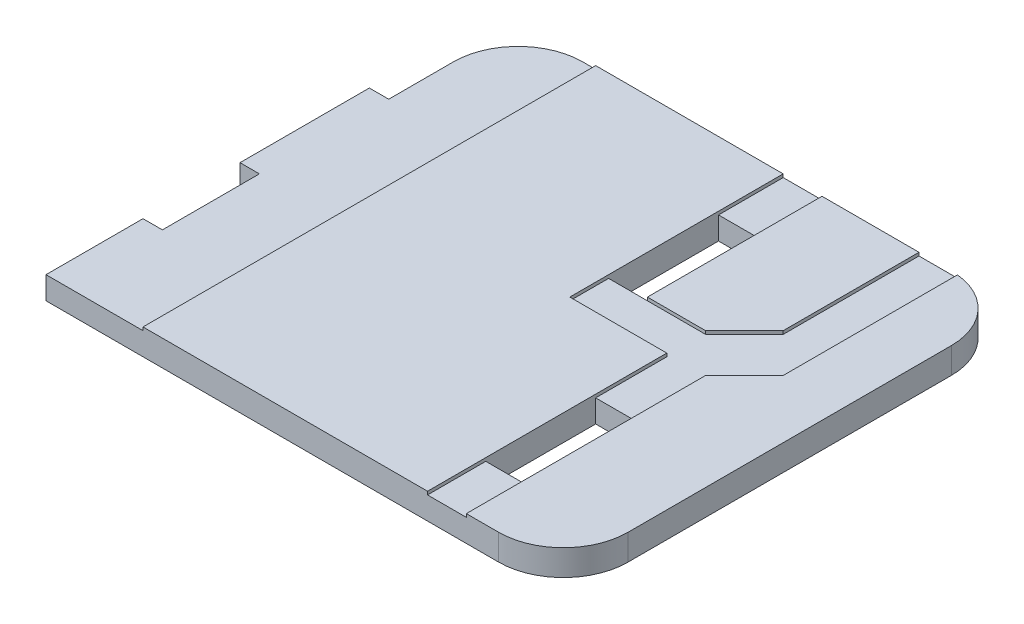
ISO-10303-21;
HEADER;
FILE_DESCRIPTION(('STEP AP214'),'2;1');
FILE_NAME('part.step','',(''),(''),'','','');
FILE_SCHEMA(('AUTOMOTIVE_DESIGN { 1 0 10303 214 1 1 1 1 }'));
ENDSEC;
DATA;
#1=APPLICATION_CONTEXT('core data for automotive mechanical design processes');
#2=APPLICATION_PROTOCOL_DEFINITION('international standard','automotive_design',2000,#1);
#3=PRODUCT_CONTEXT('',#1,'mechanical');
#4=PRODUCT('Part','Part','',(#3));
#5=PRODUCT_RELATED_PRODUCT_CATEGORY('part','',(#4));
#6=PRODUCT_DEFINITION_FORMATION('','',#4);
#7=PRODUCT_DEFINITION_CONTEXT('part definition',#1,'design');
#8=PRODUCT_DEFINITION('design','',#6,#7);
#9=PRODUCT_DEFINITION_SHAPE('','',#8);
#10=(LENGTH_UNIT() NAMED_UNIT(*) SI_UNIT(.MILLI.,.METRE.));
#11=(NAMED_UNIT(*) PLANE_ANGLE_UNIT() SI_UNIT($,.RADIAN.));
#12=(NAMED_UNIT(*) SI_UNIT($,.STERADIAN.) SOLID_ANGLE_UNIT());
#13=UNCERTAINTY_MEASURE_WITH_UNIT(LENGTH_MEASURE(1.E-05),#10,'distance_accuracy_value','');
#14=(GEOMETRIC_REPRESENTATION_CONTEXT(3) GLOBAL_UNCERTAINTY_ASSIGNED_CONTEXT((#13)) GLOBAL_UNIT_ASSIGNED_CONTEXT((#10,
#11,#12)) REPRESENTATION_CONTEXT('',''));
#15=CARTESIAN_POINT('',(0.,0.,0.));
#16=DIRECTION('',(0.,0.,1.));
#17=DIRECTION('',(1.,0.,0.));
#18=AXIS2_PLACEMENT_3D('',#15,#16,#17);
#19=CARTESIAN_POINT('',(0.,0.4,0.));
#20=DIRECTION('',(0.,1.,0.));
#21=DIRECTION('',(0.,0.,1.));
#22=AXIS2_PLACEMENT_3D('',#19,#20,#21);
#23=PLANE('',#22);
#24=DIRECTION('',(0.,0.,-1.));
#25=VECTOR('',#24,1.);
#26=CARTESIAN_POINT('',(1.5,0.4,0.));
#27=LINE('',#26,#25);
#28=CARTESIAN_POINT('',(1.5,0.4,0.));
#29=VERTEX_POINT('',#28);
#30=CARTESIAN_POINT('',(1.5,0.4,-7.));
#31=VERTEX_POINT('',#30);
#32=EDGE_CURVE('E338',#29,#31,#27,.T.);
#33=ORIENTED_EDGE('',*,*,#32,.F.);
#34=DIRECTION('',(1.,0.,0.));
#35=VECTOR('',#34,1.);
#36=CARTESIAN_POINT('',(0.,0.4,0.));
#37=LINE('',#36,#35);
#38=CARTESIAN_POINT('',(5.9,0.4,0.));
#39=VERTEX_POINT('',#38);
#40=EDGE_CURVE('E344',#29,#39,#37,.T.);
#41=ORIENTED_EDGE('',*,*,#40,.T.);
#42=DIRECTION('',(0.,0.,1.));
#43=VECTOR('',#42,1.);
#44=CARTESIAN_POINT('',(5.9,0.4,-0.9));
#45=LINE('',#44,#43);
#46=CARTESIAN_POINT('',(5.9,0.4,-3.7));
#47=VERTEX_POINT('',#46);
#48=EDGE_CURVE('E443',#47,#39,#45,.T.);
#49=ORIENTED_EDGE('',*,*,#48,.F.);
#50=DIRECTION('',(1.,0.,0.));
#51=VECTOR('',#50,1.);
#52=CARTESIAN_POINT('',(4.4,0.4,-3.7));
#53=LINE('',#52,#51);
#54=CARTESIAN_POINT('',(4.4,0.4,-3.7));
#55=VERTEX_POINT('',#54);
#56=EDGE_CURVE('E374',#55,#47,#53,.T.);
#57=ORIENTED_EDGE('',*,*,#56,.F.);
#58=DIRECTION('',(0.,0.,1.));
#59=VECTOR('',#58,1.);
#60=CARTESIAN_POINT('',(4.4,0.4,-6.));
#61=LINE('',#60,#59);
#62=CARTESIAN_POINT('',(4.4,0.4,-7.));
#63=VERTEX_POINT('',#62);
#64=EDGE_CURVE('E467',#63,#55,#61,.T.);
#65=ORIENTED_EDGE('',*,*,#64,.F.);
#66=DIRECTION('',(-1.,0.,0.));
#67=VECTOR('',#66,1.);
#68=CARTESIAN_POINT('',(8.,0.4,-7.));
#69=LINE('',#68,#67);
#70=EDGE_CURVE('E498',#63,#31,#69,.T.);
#71=ORIENTED_EDGE('',*,*,#70,.T.);
#72=EDGE_LOOP('',(#33,#41,#49,#57,#65,#71));
#73=FACE_BOUND('',#72,.T.);
#74=ADVANCED_FACE('F89',(#73),#23,.T.);
#75=CARTESIAN_POINT('',(6.5,0.4,-7.));
#76=VERTEX_POINT('',#75);
#77=CARTESIAN_POINT('',(5.,0.4,-7.));
#78=VERTEX_POINT('',#77);
#79=EDGE_CURVE('E501',#76,#78,#69,.T.);
#80=ORIENTED_EDGE('',*,*,#79,.T.);
#81=DIRECTION('',(0.,0.,-1.));
#82=VECTOR('',#81,1.);
#83=CARTESIAN_POINT('',(5.,0.4,-6.));
#84=LINE('',#83,#82);
#85=CARTESIAN_POINT('',(5.,0.4,-4.3));
#86=VERTEX_POINT('',#85);
#87=EDGE_CURVE('E469',#86,#78,#84,.T.);
#88=ORIENTED_EDGE('',*,*,#87,.F.);
#89=DIRECTION('',(1.,0.,0.));
#90=VECTOR('',#89,1.);
#91=CARTESIAN_POINT('',(4.4,0.4,-4.3));
#92=LINE('',#91,#90);
#93=CARTESIAN_POINT('',(5.9,0.4,-4.3));
#94=VERTEX_POINT('',#93);
#95=EDGE_CURVE('E400',#86,#94,#92,.T.);
#96=ORIENTED_EDGE('',*,*,#95,.T.);
#97=DIRECTION('',(0.707106781186548,0.,-0.707106781186548));
#98=VECTOR('',#97,1.);
#99=CARTESIAN_POINT('',(5.9,0.4,-4.3));
#100=LINE('',#99,#98);
#101=CARTESIAN_POINT('',(6.5,0.4,-4.9));
#102=VERTEX_POINT('',#101);
#103=EDGE_CURVE('E403',#94,#102,#100,.T.);
#104=ORIENTED_EDGE('',*,*,#103,.T.);
#105=DIRECTION('',(0.,0.,-1.));
#106=VECTOR('',#105,1.);
#107=CARTESIAN_POINT('',(6.5,0.4,-4.9));
#108=LINE('',#107,#106);
#109=EDGE_CURVE('E407',#102,#76,#108,.T.);
#110=ORIENTED_EDGE('',*,*,#109,.T.);
#111=EDGE_LOOP('',(#80,#88,#96,#104,#110));
#112=FACE_BOUND('',#111,.T.);
#113=ADVANCED_FACE('F594',(#112),#23,.T.);
#114=CARTESIAN_POINT('',(0.,0.4,-1.5));
#115=DIRECTION('',(1.,0.,0.));
#116=DIRECTION('',(0.,0.,-1.));
#117=AXIS2_PLACEMENT_3D('',#114,#115,#116);
#118=PLANE('',#117);
#119=DIRECTION('',(0.,0.,1.));
#120=VECTOR('',#119,1.);
#121=CARTESIAN_POINT('',(0.,0.35,0.));
#122=LINE('',#121,#120);
#123=CARTESIAN_POINT('',(0.,0.35,-1.5));
#124=VERTEX_POINT('',#123);
#125=CARTESIAN_POINT('',(0.,0.35,0.));
#126=VERTEX_POINT('',#125);
#127=EDGE_CURVE('E335',#124,#126,#122,.T.);
#128=ORIENTED_EDGE('',*,*,#127,.F.);
#129=DIRECTION('',(0.,-1.,0.));
#130=VECTOR('',#129,1.);
#131=CARTESIAN_POINT('',(0.,0.4,-1.5));
#132=LINE('',#131,#130);
#133=CARTESIAN_POINT('',(0.,0.,-1.5));
#134=VERTEX_POINT('',#133);
#135=EDGE_CURVE('E530',#124,#134,#132,.T.);
#136=ORIENTED_EDGE('',*,*,#135,.T.);
#137=DIRECTION('',(0.,0.,1.));
#138=VECTOR('',#137,1.);
#139=CARTESIAN_POINT('',(0.,0.,-1.5));
#140=LINE('',#139,#138);
#141=CARTESIAN_POINT('',(0.,0.,0.));
#142=VERTEX_POINT('',#141);
#143=EDGE_CURVE('E491',#134,#142,#140,.T.);
#144=ORIENTED_EDGE('',*,*,#143,.T.);
#145=DIRECTION('',(0.,-1.,0.));
#146=VECTOR('',#145,1.);
#147=CARTESIAN_POINT('',(0.,0.4,0.));
#148=LINE('',#147,#146);
#149=EDGE_CURVE('E542',#126,#142,#148,.T.);
#150=ORIENTED_EDGE('',*,*,#149,.F.);
#151=EDGE_LOOP('',(#128,#136,#144,#150));
#152=FACE_BOUND('',#151,.T.);
#153=ADVANCED_FACE('F697',(#152),#118,.F.);
#154=CARTESIAN_POINT('',(8.,0.4,-7.));
#155=DIRECTION('',(0.,0.,1.));
#156=DIRECTION('',(1.,0.,0.));
#157=AXIS2_PLACEMENT_3D('',#154,#155,#156);
#158=PLANE('',#157);
#159=DIRECTION('',(-1.,0.,0.));
#160=VECTOR('',#159,1.);
#161=CARTESIAN_POINT('',(0.,0.35,-7.));
#162=LINE('',#161,#160);
#163=CARTESIAN_POINT('',(1.5,0.35,-7.));
#164=VERTEX_POINT('',#163);
#165=CARTESIAN_POINT('',(1.3,0.35,-7.));
#166=VERTEX_POINT('',#165);
#167=EDGE_CURVE('E329',#164,#166,#162,.T.);
#168=ORIENTED_EDGE('',*,*,#167,.F.);
#169=DIRECTION('',(0.,1.,0.));
#170=VECTOR('',#169,1.);
#171=CARTESIAN_POINT('',(1.5,0.35,-7.));
#172=LINE('',#171,#170);
#173=EDGE_CURVE('E326',#164,#31,#172,.T.);
#174=ORIENTED_EDGE('',*,*,#173,.T.);
#175=ORIENTED_EDGE('',*,*,#70,.F.);
#176=DIRECTION('',(0.,1.,0.));
#177=VECTOR('',#176,1.);
#178=CARTESIAN_POINT('',(4.4,0.35,-7.));
#179=LINE('',#178,#177);
#180=CARTESIAN_POINT('',(4.4,0.35,-7.));
#181=VERTEX_POINT('',#180);
#182=EDGE_CURVE('E355',#181,#63,#179,.T.);
#183=ORIENTED_EDGE('',*,*,#182,.F.);
#184=DIRECTION('',(1.,0.,0.));
#185=VECTOR('',#184,1.);
#186=CARTESIAN_POINT('',(4.4,0.35,-7.));
#187=LINE('',#186,#185);
#188=CARTESIAN_POINT('',(5.,0.35,-7.));
#189=VERTEX_POINT('',#188);
#190=EDGE_CURVE('E364',#181,#189,#187,.T.);
#191=ORIENTED_EDGE('',*,*,#190,.T.);
#192=DIRECTION('',(0.,1.,0.));
#193=VECTOR('',#192,1.);
#194=CARTESIAN_POINT('',(5.,0.35,-7.));
#195=LINE('',#194,#193);
#196=EDGE_CURVE('E352',#189,#78,#195,.T.);
#197=ORIENTED_EDGE('',*,*,#196,.T.);
#198=ORIENTED_EDGE('',*,*,#79,.F.);
#199=DIRECTION('',(0.,1.,0.));
#200=VECTOR('',#199,1.);
#201=CARTESIAN_POINT('',(6.5,0.4,-7.));
#202=LINE('',#201,#200);
#203=CARTESIAN_POINT('',(6.5,0.35,-7.));
#204=VERTEX_POINT('',#203);
#205=EDGE_CURVE('E12',#204,#76,#202,.T.);
#206=ORIENTED_EDGE('',*,*,#205,.F.);
#207=DIRECTION('',(-1.,0.,0.));
#208=VECTOR('',#207,1.);
#209=CARTESIAN_POINT('',(8.,0.35,-7.));
#210=LINE('',#209,#208);
#211=CARTESIAN_POINT('',(7.,0.35,-7.));
#212=VERTEX_POINT('',#211);
#213=EDGE_CURVE('E346',#212,#204,#210,.T.);
#214=ORIENTED_EDGE('',*,*,#213,.F.);
#215=DIRECTION('',(0.,-1.,0.));
#216=VECTOR('',#215,1.);
#217=CARTESIAN_POINT('',(7.,0.4,-7.));
#218=LINE('',#217,#216);
#219=CARTESIAN_POINT('',(7.,0.,-7.));
#220=VERTEX_POINT('',#219);
#221=EDGE_CURVE('E566',#212,#220,#218,.T.);
#222=ORIENTED_EDGE('',*,*,#221,.T.);
#223=DIRECTION('',(-1.,0.,0.));
#224=VECTOR('',#223,1.);
#225=CARTESIAN_POINT('',(8.,0.,-7.));
#226=LINE('',#225,#224);
#227=CARTESIAN_POINT('',(1.3,0.,-7.));
#228=VERTEX_POINT('',#227);
#229=EDGE_CURVE('E510',#220,#228,#226,.T.);
#230=ORIENTED_EDGE('',*,*,#229,.T.);
#231=DIRECTION('',(0.,-1.,0.));
#232=VECTOR('',#231,1.);
#233=CARTESIAN_POINT('',(1.3,0.4,-7.));
#234=LINE('',#233,#232);
#235=EDGE_CURVE('E563',#228,#166,#234,.F.);
#236=ORIENTED_EDGE('',*,*,#235,.T.);
#237=EDGE_LOOP('',(#168,#174,#175,#183,#191,#197,#198,#206,#214,#222,#230,#236));
#238=FACE_BOUND('',#237,.T.);
#239=ADVANCED_FACE('F586',(#238),#158,.F.);
#240=CARTESIAN_POINT('',(0.299999999999999,0.4,-7.));
#241=DIRECTION('',(1.,0.,0.));
#242=DIRECTION('',(0.,0.,-1.));
#243=AXIS2_PLACEMENT_3D('',#240,#241,#242);
#244=PLANE('',#243);
#245=DIRECTION('',(0.,0.,1.));
#246=VECTOR('',#245,1.);
#247=CARTESIAN_POINT('',(0.3,0.35,0.));
#248=LINE('',#247,#246);
#249=CARTESIAN_POINT('',(0.299999999999999,0.35,-6.));
#250=VERTEX_POINT('',#249);
#251=CARTESIAN_POINT('',(0.299999999999999,0.35,-5.));
#252=VERTEX_POINT('',#251);
#253=EDGE_CURVE('E662',#250,#252,#248,.T.);
#254=ORIENTED_EDGE('',*,*,#253,.F.);
#255=DIRECTION('',(0.,-1.,0.));
#256=VECTOR('',#255,1.);
#257=CARTESIAN_POINT('',(0.299999999999999,0.4,-6.));
#258=LINE('',#257,#256);
#259=CARTESIAN_POINT('',(0.299999999999999,0.,-6.));
#260=VERTEX_POINT('',#259);
#261=EDGE_CURVE('E568',#250,#260,#258,.T.);
#262=ORIENTED_EDGE('',*,*,#261,.T.);
#263=DIRECTION('',(0.,0.,1.));
#264=VECTOR('',#263,1.);
#265=CARTESIAN_POINT('',(0.299999999999999,0.,-7.));
#266=LINE('',#265,#264);
#267=CARTESIAN_POINT('',(0.299999999999999,0.,-5.));
#268=VERTEX_POINT('',#267);
#269=EDGE_CURVE('E513',#260,#268,#266,.T.);
#270=ORIENTED_EDGE('',*,*,#269,.T.);
#271=DIRECTION('',(0.,-1.,0.));
#272=VECTOR('',#271,1.);
#273=CARTESIAN_POINT('',(0.299999999999999,0.4,-5.));
#274=LINE('',#273,#272);
#275=EDGE_CURVE('E540',#252,#268,#274,.T.);
#276=ORIENTED_EDGE('',*,*,#275,.F.);
#277=EDGE_LOOP('',(#254,#262,#270,#276));
#278=FACE_BOUND('',#277,.T.);
#279=ADVANCED_FACE('F770',(#278),#244,.F.);
#280=CARTESIAN_POINT('',(0.299999999999999,0.4,-5.));
#281=DIRECTION('',(0.,0.,1.));
#282=DIRECTION('',(1.,0.,0.));
#283=AXIS2_PLACEMENT_3D('',#280,#281,#282);
#284=PLANE('',#283);
#285=DIRECTION('',(-1.,0.,0.));
#286=VECTOR('',#285,1.);
#287=CARTESIAN_POINT('',(0.,0.35,-5.));
#288=LINE('',#287,#286);
#289=CARTESIAN_POINT('',(0.,0.35,-5.));
#290=VERTEX_POINT('',#289);
#291=EDGE_CURVE('E664',#252,#290,#288,.T.);
#292=ORIENTED_EDGE('',*,*,#291,.F.);
#293=ORIENTED_EDGE('',*,*,#275,.T.);
#294=DIRECTION('',(-1.,0.,0.));
#295=VECTOR('',#294,1.);
#296=CARTESIAN_POINT('',(0.299999999999999,0.,-5.));
#297=LINE('',#296,#295);
#298=CARTESIAN_POINT('',(0.,0.,-5.));
#299=VERTEX_POINT('',#298);
#300=EDGE_CURVE('E516',#268,#299,#297,.T.);
#301=ORIENTED_EDGE('',*,*,#300,.T.);
#302=DIRECTION('',(0.,-1.,0.));
#303=VECTOR('',#302,1.);
#304=CARTESIAN_POINT('',(0.,0.4,-5.));
#305=LINE('',#304,#303);
#306=EDGE_CURVE('E538',#290,#299,#305,.T.);
#307=ORIENTED_EDGE('',*,*,#306,.F.);
#308=EDGE_LOOP('',(#292,#293,#301,#307));
#309=FACE_BOUND('',#308,.T.);
#310=ADVANCED_FACE('F760',(#309),#284,.F.);
#311=CARTESIAN_POINT('',(0.,0.4,-5.));
#312=DIRECTION('',(1.,0.,0.));
#313=DIRECTION('',(0.,0.,-1.));
#314=AXIS2_PLACEMENT_3D('',#311,#312,#313);
#315=PLANE('',#314);
#316=DIRECTION('',(0.,0.,1.));
#317=VECTOR('',#316,1.);
#318=CARTESIAN_POINT('',(0.,0.35,0.));
#319=LINE('',#318,#317);
#320=CARTESIAN_POINT('',(0.,0.35,-3.));
#321=VERTEX_POINT('',#320);
#322=EDGE_CURVE('E669',#290,#321,#319,.T.);
#323=ORIENTED_EDGE('',*,*,#322,.F.);
#324=ORIENTED_EDGE('',*,*,#306,.T.);
#325=DIRECTION('',(0.,0.,1.));
#326=VECTOR('',#325,1.);
#327=CARTESIAN_POINT('',(0.,0.,-5.));
#328=LINE('',#327,#326);
#329=CARTESIAN_POINT('',(0.,0.,-3.));
#330=VERTEX_POINT('',#329);
#331=EDGE_CURVE('E519',#299,#330,#328,.T.);
#332=ORIENTED_EDGE('',*,*,#331,.T.);
#333=DIRECTION('',(0.,-1.,0.));
#334=VECTOR('',#333,1.);
#335=CARTESIAN_POINT('',(0.,0.4,-3.));
#336=LINE('',#335,#334);
#337=EDGE_CURVE('E536',#321,#330,#336,.T.);
#338=ORIENTED_EDGE('',*,*,#337,.F.);
#339=EDGE_LOOP('',(#323,#324,#332,#338));
#340=FACE_BOUND('',#339,.T.);
#341=ADVANCED_FACE('F750',(#340),#315,.F.);
#342=CARTESIAN_POINT('',(0.,0.4,-3.));
#343=DIRECTION('',(0.,0.,-1.));
#344=DIRECTION('',(-1.,0.,0.));
#345=AXIS2_PLACEMENT_3D('',#342,#343,#344);
#346=PLANE('',#345);
#347=DIRECTION('',(1.,0.,0.));
#348=VECTOR('',#347,1.);
#349=CARTESIAN_POINT('',(0.,0.35,-3.));
#350=LINE('',#349,#348);
#351=CARTESIAN_POINT('',(0.3,0.35,-3.));
#352=VERTEX_POINT('',#351);
#353=EDGE_CURVE('E671',#321,#352,#350,.T.);
#354=ORIENTED_EDGE('',*,*,#353,.F.);
#355=ORIENTED_EDGE('',*,*,#337,.T.);
#356=DIRECTION('',(1.,0.,0.));
#357=VECTOR('',#356,1.);
#358=CARTESIAN_POINT('',(0.,0.,-3.));
#359=LINE('',#358,#357);
#360=CARTESIAN_POINT('',(0.3,0.,-3.));
#361=VERTEX_POINT('',#360);
#362=EDGE_CURVE('E522',#330,#361,#359,.T.);
#363=ORIENTED_EDGE('',*,*,#362,.T.);
#364=DIRECTION('',(0.,-1.,0.));
#365=VECTOR('',#364,1.);
#366=CARTESIAN_POINT('',(0.3,0.4,-3.));
#367=LINE('',#366,#365);
#368=EDGE_CURVE('E534',#352,#361,#367,.T.);
#369=ORIENTED_EDGE('',*,*,#368,.F.);
#370=EDGE_LOOP('',(#354,#355,#363,#369));
#371=FACE_BOUND('',#370,.T.);
#372=ADVANCED_FACE('F740',(#371),#346,.F.);
#373=CARTESIAN_POINT('',(0.3,0.4,-3.));
#374=DIRECTION('',(1.,0.,0.));
#375=DIRECTION('',(0.,0.,-1.));
#376=AXIS2_PLACEMENT_3D('',#373,#374,#375);
#377=PLANE('',#376);
#378=DIRECTION('',(0.,0.,1.));
#379=VECTOR('',#378,1.);
#380=CARTESIAN_POINT('',(0.3,0.35,0.));
#381=LINE('',#380,#379);
#382=CARTESIAN_POINT('',(0.3,0.35,-1.5));
#383=VERTEX_POINT('',#382);
#384=EDGE_CURVE('E673',#352,#383,#381,.T.);
#385=ORIENTED_EDGE('',*,*,#384,.F.);
#386=ORIENTED_EDGE('',*,*,#368,.T.);
#387=DIRECTION('',(0.,0.,1.));
#388=VECTOR('',#387,1.);
#389=CARTESIAN_POINT('',(0.3,0.,-3.));
#390=LINE('',#389,#388);
#391=CARTESIAN_POINT('',(0.3,0.,-1.5));
#392=VERTEX_POINT('',#391);
#393=EDGE_CURVE('E525',#361,#392,#390,.T.);
#394=ORIENTED_EDGE('',*,*,#393,.T.);
#395=DIRECTION('',(0.,-1.,0.));
#396=VECTOR('',#395,1.);
#397=CARTESIAN_POINT('',(0.3,0.4,-1.5));
#398=LINE('',#397,#396);
#399=EDGE_CURVE('E532',#383,#392,#398,.T.);
#400=ORIENTED_EDGE('',*,*,#399,.F.);
#401=EDGE_LOOP('',(#385,#386,#394,#400));
#402=FACE_BOUND('',#401,.T.);
#403=ADVANCED_FACE('F730',(#402),#377,.F.);
#404=CARTESIAN_POINT('',(0.3,0.4,-1.5));
#405=DIRECTION('',(0.,0.,1.));
#406=DIRECTION('',(1.,0.,0.));
#407=AXIS2_PLACEMENT_3D('',#404,#405,#406);
#408=PLANE('',#407);
#409=DIRECTION('',(-1.,0.,0.));
#410=VECTOR('',#409,1.);
#411=CARTESIAN_POINT('',(0.,0.35,-1.5));
#412=LINE('',#411,#410);
#413=EDGE_CURVE('E348',#383,#124,#412,.T.);
#414=ORIENTED_EDGE('',*,*,#413,.F.);
#415=ORIENTED_EDGE('',*,*,#399,.T.);
#416=DIRECTION('',(-1.,0.,0.));
#417=VECTOR('',#416,1.);
#418=CARTESIAN_POINT('',(0.3,0.,-1.5));
#419=LINE('',#418,#417);
#420=EDGE_CURVE('E494',#392,#134,#419,.T.);
#421=ORIENTED_EDGE('',*,*,#420,.T.);
#422=ORIENTED_EDGE('',*,*,#135,.F.);
#423=EDGE_LOOP('',(#414,#415,#421,#422));
#424=FACE_BOUND('',#423,.T.);
#425=ADVANCED_FACE('F688',(#424),#408,.F.);
#426=CARTESIAN_POINT('',(4.4,0.4,-4.3));
#427=DIRECTION('',(0.,0.,-1.));
#428=DIRECTION('',(-1.,0.,0.));
#429=AXIS2_PLACEMENT_3D('',#426,#427,#428);
#430=PLANE('',#429);
#431=DIRECTION('',(0.,-1.,0.));
#432=VECTOR('',#431,1.);
#433=CARTESIAN_POINT('',(4.4,0.4,-4.3));
#434=LINE('',#433,#432);
#435=CARTESIAN_POINT('',(4.4,0.35,-4.3));
#436=VERTEX_POINT('',#435);
#437=CARTESIAN_POINT('',(4.4,0.,-4.3));
#438=VERTEX_POINT('',#437);
#439=EDGE_CURVE('E489',#436,#438,#434,.T.);
#440=ORIENTED_EDGE('',*,*,#439,.F.);
#441=DIRECTION('',(1.,0.,0.));
#442=VECTOR('',#441,1.);
#443=CARTESIAN_POINT('',(5.,0.35,-4.3));
#444=LINE('',#443,#442);
#445=CARTESIAN_POINT('',(5.,0.35,-4.3));
#446=VERTEX_POINT('',#445);
#447=EDGE_CURVE('E417',#436,#446,#444,.T.);
#448=ORIENTED_EDGE('',*,*,#447,.T.);
#449=DIRECTION('',(0.,-1.,0.));
#450=VECTOR('',#449,1.);
#451=CARTESIAN_POINT('',(5.,0.4,-4.3));
#452=LINE('',#451,#450);
#453=CARTESIAN_POINT('',(5.,0.,-4.3));
#454=VERTEX_POINT('',#453);
#455=EDGE_CURVE('E486',#446,#454,#452,.T.);
#456=ORIENTED_EDGE('',*,*,#455,.T.);
#457=DIRECTION('',(1.,0.,0.));
#458=VECTOR('',#457,1.);
#459=CARTESIAN_POINT('',(4.4,0.,-4.3));
#460=LINE('',#459,#458);
#461=EDGE_CURVE('E475',#438,#454,#460,.T.);
#462=ORIENTED_EDGE('',*,*,#461,.F.);
#463=EDGE_LOOP('',(#440,#448,#456,#462));
#464=FACE_BOUND('',#463,.T.);
#465=ADVANCED_FACE('F607',(#464),#430,.T.);
#466=CARTESIAN_POINT('',(4.4,0.4,-6.));
#467=DIRECTION('',(0.,0.,1.));
#468=DIRECTION('',(1.,0.,0.));
#469=AXIS2_PLACEMENT_3D('',#466,#467,#468);
#470=PLANE('',#469);
#471=DIRECTION('',(0.,-1.,0.));
#472=VECTOR('',#471,1.);
#473=CARTESIAN_POINT('',(5.,0.4,-6.));
#474=LINE('',#473,#472);
#475=CARTESIAN_POINT('',(5.,0.35,-6.));
#476=VERTEX_POINT('',#475);
#477=CARTESIAN_POINT('',(5.,0.,-6.));
#478=VERTEX_POINT('',#477);
#479=EDGE_CURVE('E484',#476,#478,#474,.T.);
#480=ORIENTED_EDGE('',*,*,#479,.F.);
#481=DIRECTION('',(1.,0.,0.));
#482=VECTOR('',#481,1.);
#483=CARTESIAN_POINT('',(4.4,0.35,-6.));
#484=LINE('',#483,#482);
#485=CARTESIAN_POINT('',(4.4,0.35,-6.));
#486=VERTEX_POINT('',#485);
#487=EDGE_CURVE('E359',#486,#476,#484,.T.);
#488=ORIENTED_EDGE('',*,*,#487,.F.);
#489=DIRECTION('',(0.,-1.,0.));
#490=VECTOR('',#489,1.);
#491=CARTESIAN_POINT('',(4.4,0.4,-6.));
#492=LINE('',#491,#490);
#493=CARTESIAN_POINT('',(4.4,0.,-6.));
#494=VERTEX_POINT('',#493);
#495=EDGE_CURVE('E472',#486,#494,#492,.T.);
#496=ORIENTED_EDGE('',*,*,#495,.T.);
#497=DIRECTION('',(-1.,0.,0.));
#498=VECTOR('',#497,1.);
#499=CARTESIAN_POINT('',(4.4,0.,-6.));
#500=LINE('',#499,#498);
#501=EDGE_CURVE('E470',#478,#494,#500,.T.);
#502=ORIENTED_EDGE('',*,*,#501,.F.);
#503=EDGE_LOOP('',(#480,#488,#496,#502));
#504=FACE_BOUND('',#503,.T.);
#505=ADVANCED_FACE('F680',(#504),#470,.T.);
#506=CARTESIAN_POINT('',(5.9,0.4,-2.6));
#507=DIRECTION('',(0.,0.,1.));
#508=DIRECTION('',(1.,0.,0.));
#509=AXIS2_PLACEMENT_3D('',#506,#507,#508);
#510=PLANE('',#509);
#511=DIRECTION('',(0.,-1.,0.));
#512=VECTOR('',#511,1.);
#513=CARTESIAN_POINT('',(6.5,0.4,-2.6));
#514=LINE('',#513,#512);
#515=CARTESIAN_POINT('',(6.5,0.35,-2.6));
#516=VERTEX_POINT('',#515);
#517=CARTESIAN_POINT('',(6.5,0.,-2.6));
#518=VERTEX_POINT('',#517);
#519=EDGE_CURVE('E460',#516,#518,#514,.T.);
#520=ORIENTED_EDGE('',*,*,#519,.F.);
#521=DIRECTION('',(-1.,0.,0.));
#522=VECTOR('',#521,1.);
#523=CARTESIAN_POINT('',(6.5,0.35,-2.6));
#524=LINE('',#523,#522);
#525=CARTESIAN_POINT('',(5.9,0.35,-2.6));
#526=VERTEX_POINT('',#525);
#527=EDGE_CURVE('E431',#516,#526,#524,.T.);
#528=ORIENTED_EDGE('',*,*,#527,.T.);
#529=DIRECTION('',(0.,-1.,0.));
#530=VECTOR('',#529,1.);
#531=CARTESIAN_POINT('',(5.9,0.4,-2.6));
#532=LINE('',#531,#530);
#533=CARTESIAN_POINT('',(5.9,0.,-2.6));
#534=VERTEX_POINT('',#533);
#535=EDGE_CURVE('E448',#526,#534,#532,.T.);
#536=ORIENTED_EDGE('',*,*,#535,.T.);
#537=DIRECTION('',(-1.,0.,0.));
#538=VECTOR('',#537,1.);
#539=CARTESIAN_POINT('',(5.9,0.,-2.6));
#540=LINE('',#539,#538);
#541=EDGE_CURVE('E446',#518,#534,#540,.T.);
#542=ORIENTED_EDGE('',*,*,#541,.F.);
#543=EDGE_LOOP('',(#520,#528,#536,#542));
#544=FACE_BOUND('',#543,.T.);
#545=ADVANCED_FACE('F634',(#544),#510,.T.);
#546=CARTESIAN_POINT('',(1.3,0.4,-6.));
#547=DIRECTION('',(0.,-1.,0.));
#548=DIRECTION('',(0.,0.,-1.));
#549=AXIS2_PLACEMENT_3D('',#546,#547,#548);
#550=CYLINDRICAL_SURFACE('',#549,1.);
#551=ORIENTED_EDGE('',*,*,#261,.F.);
#552=CARTESIAN_POINT('',(1.3,0.35,-6.));
#553=DIRECTION('',(0.,1.,0.));
#554=DIRECTION('',(0.,0.,1.));
#555=AXIS2_PLACEMENT_3D('',#552,#553,#554);
#556=CIRCLE('',#555,1.);
#557=EDGE_CURVE('E660',#166,#250,#556,.T.);
#558=ORIENTED_EDGE('',*,*,#557,.F.);
#559=ORIENTED_EDGE('',*,*,#235,.F.);
#560=CARTESIAN_POINT('',(1.3,0.,-6.));
#561=DIRECTION('',(0.,1.,0.));
#562=DIRECTION('',(0.,0.,1.));
#563=AXIS2_PLACEMENT_3D('',#560,#561,#562);
#564=CIRCLE('',#563,1.);
#565=EDGE_CURVE('E549',#260,#228,#564,.F.);
#566=ORIENTED_EDGE('',*,*,#565,.F.);
#567=EDGE_LOOP('',(#551,#558,#559,#566));
#568=FACE_BOUND('',#567,.T.);
#569=ADVANCED_FACE('F91',(#568),#550,.T.);
#570=DIRECTION('',(0.,0.,-1.));
#571=VECTOR('',#570,1.);
#572=CARTESIAN_POINT('',(7.1,0.4,-6.99498743710662));
#573=LINE('',#572,#571);
#574=CARTESIAN_POINT('',(7.1,0.4,-4.3));
#575=VERTEX_POINT('',#574);
#576=CARTESIAN_POINT('',(7.1,0.4,-6.99498743710662));
#577=VERTEX_POINT('',#576);
#578=EDGE_CURVE('E410',#575,#577,#573,.T.);
#579=ORIENTED_EDGE('',*,*,#578,.F.);
#580=DIRECTION('',(0.707106781186547,0.,-0.707106781186547));
#581=VECTOR('',#580,1.);
#582=CARTESIAN_POINT('',(6.5,0.4,-3.7));
#583=LINE('',#582,#581);
#584=CARTESIAN_POINT('',(6.5,0.4,-3.7));
#585=VERTEX_POINT('',#584);
#586=EDGE_CURVE('E412',#585,#575,#583,.T.);
#587=ORIENTED_EDGE('',*,*,#586,.F.);
#588=DIRECTION('',(0.,0.,-1.));
#589=VECTOR('',#588,1.);
#590=CARTESIAN_POINT('',(6.5,0.4,-0.9));
#591=LINE('',#590,#589);
#592=CARTESIAN_POINT('',(6.5,0.4,0.));
#593=VERTEX_POINT('',#592);
#594=EDGE_CURVE('E445',#593,#585,#591,.T.);
#595=ORIENTED_EDGE('',*,*,#594,.F.);
#596=CARTESIAN_POINT('',(7.,0.4,0.));
#597=VERTEX_POINT('',#596);
#598=EDGE_CURVE('E492',#593,#597,#37,.T.);
#599=ORIENTED_EDGE('',*,*,#598,.T.);
#600=CARTESIAN_POINT('',(7.,0.4,-1.));
#601=DIRECTION('',(0.,1.,0.));
#602=DIRECTION('',(0.,0.,1.));
#603=AXIS2_PLACEMENT_3D('',#600,#601,#602);
#604=CIRCLE('',#603,1.);
#605=CARTESIAN_POINT('',(8.,0.4,-1.));
#606=VERTEX_POINT('',#605);
#607=EDGE_CURVE('E561',#597,#606,#604,.T.);
#608=ORIENTED_EDGE('',*,*,#607,.T.);
#609=DIRECTION('',(0.,0.,-1.));
#610=VECTOR('',#609,1.);
#611=CARTESIAN_POINT('',(8.,0.4,0.));
#612=LINE('',#611,#610);
#613=CARTESIAN_POINT('',(8.,0.4,-6.));
#614=VERTEX_POINT('',#613);
#615=EDGE_CURVE('E495',#606,#614,#612,.T.);
#616=ORIENTED_EDGE('',*,*,#615,.T.);
#617=CARTESIAN_POINT('',(7.,0.4,-6.));
#618=DIRECTION('',(0.,1.,0.));
#619=DIRECTION('',(0.,0.,1.));
#620=AXIS2_PLACEMENT_3D('',#617,#618,#619);
#621=CIRCLE('',#620,1.);
#622=EDGE_CURVE('E558',#614,#577,#621,.T.);
#623=ORIENTED_EDGE('',*,*,#622,.T.);
#624=EDGE_LOOP('',(#579,#587,#595,#599,#608,#616,#623));
#625=FACE_BOUND('',#624,.T.);
#626=ADVANCED_FACE('F644',(#625),#23,.T.);
#627=CARTESIAN_POINT('',(0.,0.,0.));
#628=DIRECTION('',(0.,1.,0.));
#629=DIRECTION('',(0.,0.,1.));
#630=AXIS2_PLACEMENT_3D('',#627,#628,#629);
#631=PLANE('',#630);
#632=DIRECTION('',(0.,0.,1.));
#633=VECTOR('',#632,1.);
#634=CARTESIAN_POINT('',(4.4,0.,-6.));
#635=LINE('',#634,#633);
#636=EDGE_CURVE('E466',#494,#438,#635,.T.);
#637=ORIENTED_EDGE('',*,*,#636,.T.);
#638=ORIENTED_EDGE('',*,*,#461,.T.);
#639=DIRECTION('',(0.,0.,-1.));
#640=VECTOR('',#639,1.);
#641=CARTESIAN_POINT('',(5.,0.,-6.));
#642=LINE('',#641,#640);
#643=EDGE_CURVE('E478',#454,#478,#642,.T.);
#644=ORIENTED_EDGE('',*,*,#643,.T.);
#645=ORIENTED_EDGE('',*,*,#501,.T.);
#646=EDGE_LOOP('',(#637,#638,#644,#645));
#647=FACE_BOUND('',#646,.T.);
#648=DIRECTION('',(0.,0.,-1.));
#649=VECTOR('',#648,1.);
#650=CARTESIAN_POINT('',(8.,0.,0.));
#651=LINE('',#650,#649);
#652=CARTESIAN_POINT('',(8.,0.,-1.));
#653=VERTEX_POINT('',#652);
#654=CARTESIAN_POINT('',(8.,0.,-6.));
#655=VERTEX_POINT('',#654);
#656=EDGE_CURVE('E507',#653,#655,#651,.T.);
#657=ORIENTED_EDGE('',*,*,#656,.F.);
#658=CARTESIAN_POINT('',(7.,0.,-1.));
#659=DIRECTION('',(0.,1.,0.));
#660=DIRECTION('',(0.,0.,1.));
#661=AXIS2_PLACEMENT_3D('',#658,#659,#660);
#662=CIRCLE('',#661,1.);
#663=CARTESIAN_POINT('',(7.,0.,0.));
#664=VERTEX_POINT('',#663);
#665=EDGE_CURVE('E553',#653,#664,#662,.F.);
#666=ORIENTED_EDGE('',*,*,#665,.T.);
#667=DIRECTION('',(1.,0.,0.));
#668=VECTOR('',#667,1.);
#669=CARTESIAN_POINT('',(0.,0.,0.));
#670=LINE('',#669,#668);
#671=EDGE_CURVE('E504',#142,#664,#670,.T.);
#672=ORIENTED_EDGE('',*,*,#671,.F.);
#673=ORIENTED_EDGE('',*,*,#143,.F.);
#674=ORIENTED_EDGE('',*,*,#420,.F.);
#675=ORIENTED_EDGE('',*,*,#393,.F.);
#676=ORIENTED_EDGE('',*,*,#362,.F.);
#677=ORIENTED_EDGE('',*,*,#331,.F.);
#678=ORIENTED_EDGE('',*,*,#300,.F.);
#679=ORIENTED_EDGE('',*,*,#269,.F.);
#680=ORIENTED_EDGE('',*,*,#565,.T.);
#681=ORIENTED_EDGE('',*,*,#229,.F.);
#682=CARTESIAN_POINT('',(7.,0.,-6.));
#683=DIRECTION('',(0.,1.,0.));
#684=DIRECTION('',(0.,0.,1.));
#685=AXIS2_PLACEMENT_3D('',#682,#683,#684);
#686=CIRCLE('',#685,1.);
#687=EDGE_CURVE('E551',#220,#655,#686,.F.);
#688=ORIENTED_EDGE('',*,*,#687,.T.);
#689=EDGE_LOOP('',(#657,#666,#672,#673,#674,#675,#676,#677,#678,#679,#680,#681,#688));
#690=FACE_BOUND('',#689,.T.);
#691=DIRECTION('',(0.,0.,1.));
#692=VECTOR('',#691,1.);
#693=CARTESIAN_POINT('',(5.9,0.,-0.9));
#694=LINE('',#693,#692);
#695=CARTESIAN_POINT('',(5.9,0.,-0.9));
#696=VERTEX_POINT('',#695);
#697=EDGE_CURVE('E442',#534,#696,#694,.T.);
#698=ORIENTED_EDGE('',*,*,#697,.T.);
#699=DIRECTION('',(1.,0.,0.));
#700=VECTOR('',#699,1.);
#701=CARTESIAN_POINT('',(5.9,0.,-0.9));
#702=LINE('',#701,#700);
#703=CARTESIAN_POINT('',(6.5,0.,-0.9));
#704=VERTEX_POINT('',#703);
#705=EDGE_CURVE('E451',#696,#704,#702,.T.);
#706=ORIENTED_EDGE('',*,*,#705,.T.);
#707=DIRECTION('',(0.,0.,-1.));
#708=VECTOR('',#707,1.);
#709=CARTESIAN_POINT('',(6.5,0.,-0.9));
#710=LINE('',#709,#708);
#711=EDGE_CURVE('E454',#704,#518,#710,.T.);
#712=ORIENTED_EDGE('',*,*,#711,.T.);
#713=ORIENTED_EDGE('',*,*,#541,.T.);
#714=EDGE_LOOP('',(#698,#706,#712,#713));
#715=FACE_BOUND('',#714,.T.);
#716=ADVANCED_FACE('F616',(#647,#690,#715),#631,.F.);
#717=CARTESIAN_POINT('',(0.,0.4,0.));
#718=DIRECTION('',(0.,0.,-1.));
#719=DIRECTION('',(-1.,0.,0.));
#720=AXIS2_PLACEMENT_3D('',#717,#718,#719);
#721=PLANE('',#720);
#722=ORIENTED_EDGE('',*,*,#40,.F.);
#723=DIRECTION('',(0.,1.,0.));
#724=VECTOR('',#723,1.);
#725=CARTESIAN_POINT('',(1.5,0.35,0.));
#726=LINE('',#725,#724);
#727=CARTESIAN_POINT('',(1.5,0.35,0.));
#728=VERTEX_POINT('',#727);
#729=EDGE_CURVE('E323',#728,#29,#726,.T.);
#730=ORIENTED_EDGE('',*,*,#729,.F.);
#731=DIRECTION('',(1.,0.,0.));
#732=VECTOR('',#731,1.);
#733=CARTESIAN_POINT('',(0.,0.35,0.));
#734=LINE('',#733,#732);
#735=EDGE_CURVE('E330',#126,#728,#734,.T.);
#736=ORIENTED_EDGE('',*,*,#735,.F.);
#737=ORIENTED_EDGE('',*,*,#149,.T.);
#738=ORIENTED_EDGE('',*,*,#671,.T.);
#739=DIRECTION('',(0.,-1.,0.));
#740=VECTOR('',#739,1.);
#741=CARTESIAN_POINT('',(7.,0.4,0.));
#742=LINE('',#741,#740);
#743=EDGE_CURVE('E555',#664,#597,#742,.F.);
#744=ORIENTED_EDGE('',*,*,#743,.T.);
#745=ORIENTED_EDGE('',*,*,#598,.F.);
#746=DIRECTION('',(0.,1.,0.));
#747=VECTOR('',#746,1.);
#748=CARTESIAN_POINT('',(6.5,0.35,0.));
#749=LINE('',#748,#747);
#750=CARTESIAN_POINT('',(6.5,0.35,0.));
#751=VERTEX_POINT('',#750);
#752=EDGE_CURVE('E368',#751,#593,#749,.T.);
#753=ORIENTED_EDGE('',*,*,#752,.F.);
#754=DIRECTION('',(1.,0.,0.));
#755=VECTOR('',#754,1.);
#756=CARTESIAN_POINT('',(5.9,0.35,0.));
#757=LINE('',#756,#755);
#758=CARTESIAN_POINT('',(5.9,0.35,0.));
#759=VERTEX_POINT('',#758);
#760=EDGE_CURVE('E382',#759,#751,#757,.T.);
#761=ORIENTED_EDGE('',*,*,#760,.F.);
#762=DIRECTION('',(0.,1.,0.));
#763=VECTOR('',#762,1.);
#764=CARTESIAN_POINT('',(5.9,0.35,0.));
#765=LINE('',#764,#763);
#766=EDGE_CURVE('E372',#759,#39,#765,.T.);
#767=ORIENTED_EDGE('',*,*,#766,.T.);
#768=EDGE_LOOP('',(#722,#730,#736,#737,#738,#744,#745,#753,#761,#767));
#769=FACE_BOUND('',#768,.T.);
#770=ADVANCED_FACE('F341',(#769),#721,.F.);
#771=CARTESIAN_POINT('',(8.,0.4,0.));
#772=DIRECTION('',(-1.,0.,0.));
#773=DIRECTION('',(0.,0.,1.));
#774=AXIS2_PLACEMENT_3D('',#771,#772,#773);
#775=PLANE('',#774);
#776=ORIENTED_EDGE('',*,*,#615,.F.);
#777=DIRECTION('',(0.,-1.,0.));
#778=VECTOR('',#777,1.);
#779=CARTESIAN_POINT('',(8.,0.4,-1.));
#780=LINE('',#779,#778);
#781=EDGE_CURVE('E546',#606,#653,#780,.T.);
#782=ORIENTED_EDGE('',*,*,#781,.T.);
#783=ORIENTED_EDGE('',*,*,#656,.T.);
#784=DIRECTION('',(0.,-1.,0.));
#785=VECTOR('',#784,1.);
#786=CARTESIAN_POINT('',(8.,0.4,-6.));
#787=LINE('',#786,#785);
#788=EDGE_CURVE('E544',#655,#614,#787,.F.);
#789=ORIENTED_EDGE('',*,*,#788,.T.);
#790=EDGE_LOOP('',(#776,#782,#783,#789));
#791=FACE_BOUND('',#790,.T.);
#792=ADVANCED_FACE('F649',(#791),#775,.F.);
#793=CARTESIAN_POINT('',(4.4,0.4,-6.));
#794=DIRECTION('',(1.,0.,0.));
#795=DIRECTION('',(0.,0.,-1.));
#796=AXIS2_PLACEMENT_3D('',#793,#794,#795);
#797=PLANE('',#796);
#798=ORIENTED_EDGE('',*,*,#636,.F.);
#799=ORIENTED_EDGE('',*,*,#495,.F.);
#800=DIRECTION('',(0.,0.,-1.));
#801=VECTOR('',#800,1.);
#802=CARTESIAN_POINT('',(4.4,0.35,-6.));
#803=LINE('',#802,#801);
#804=EDGE_CURVE('E104',#486,#181,#803,.T.);
#805=ORIENTED_EDGE('',*,*,#804,.T.);
#806=ORIENTED_EDGE('',*,*,#182,.T.);
#807=ORIENTED_EDGE('',*,*,#64,.T.);
#808=DIRECTION('',(0.,1.,0.));
#809=VECTOR('',#808,1.);
#810=CARTESIAN_POINT('',(4.4,0.35,-3.7));
#811=LINE('',#810,#809);
#812=CARTESIAN_POINT('',(4.4,0.35,-3.7));
#813=VERTEX_POINT('',#812);
#814=EDGE_CURVE('E385',#813,#55,#811,.T.);
#815=ORIENTED_EDGE('',*,*,#814,.F.);
#816=DIRECTION('',(0.,0.,1.));
#817=VECTOR('',#816,1.);
#818=CARTESIAN_POINT('',(4.4,0.35,-4.3));
#819=LINE('',#818,#817);
#820=EDGE_CURVE('E404',#436,#813,#819,.T.);
#821=ORIENTED_EDGE('',*,*,#820,.F.);
#822=ORIENTED_EDGE('',*,*,#439,.T.);
#823=EDGE_LOOP('',(#798,#799,#805,#806,#807,#815,#821,#822));
#824=FACE_BOUND('',#823,.T.);
#825=ADVANCED_FACE('F621',(#824),#797,.T.);
#826=CARTESIAN_POINT('',(5.,0.4,-6.));
#827=DIRECTION('',(-1.,0.,0.));
#828=DIRECTION('',(0.,0.,1.));
#829=AXIS2_PLACEMENT_3D('',#826,#827,#828);
#830=PLANE('',#829);
#831=ORIENTED_EDGE('',*,*,#643,.F.);
#832=ORIENTED_EDGE('',*,*,#455,.F.);
#833=EDGE_CURVE('E487',#86,#446,#452,.T.);
#834=ORIENTED_EDGE('',*,*,#833,.F.);
#835=ORIENTED_EDGE('',*,*,#87,.T.);
#836=ORIENTED_EDGE('',*,*,#196,.F.);
#837=DIRECTION('',(0.,0.,-1.));
#838=VECTOR('',#837,1.);
#839=CARTESIAN_POINT('',(5.,0.35,-6.));
#840=LINE('',#839,#838);
#841=EDGE_CURVE('E361',#476,#189,#840,.T.);
#842=ORIENTED_EDGE('',*,*,#841,.F.);
#843=ORIENTED_EDGE('',*,*,#479,.T.);
#844=EDGE_LOOP('',(#831,#832,#834,#835,#836,#842,#843));
#845=FACE_BOUND('',#844,.T.);
#846=ADVANCED_FACE('F612',(#845),#830,.T.);
#847=CARTESIAN_POINT('',(5.9,0.4,-0.9));
#848=DIRECTION('',(1.,0.,0.));
#849=DIRECTION('',(0.,0.,-1.));
#850=AXIS2_PLACEMENT_3D('',#847,#848,#849);
#851=PLANE('',#850);
#852=ORIENTED_EDGE('',*,*,#697,.F.);
#853=ORIENTED_EDGE('',*,*,#535,.F.);
#854=DIRECTION('',(0.,0.,1.));
#855=VECTOR('',#854,1.);
#856=CARTESIAN_POINT('',(5.9,0.35,-3.7));
#857=LINE('',#856,#855);
#858=CARTESIAN_POINT('',(5.9,0.35,-3.7));
#859=VERTEX_POINT('',#858);
#860=EDGE_CURVE('E434',#859,#526,#857,.T.);
#861=ORIENTED_EDGE('',*,*,#860,.F.);
#862=DIRECTION('',(0.,1.,0.));
#863=VECTOR('',#862,1.);
#864=CARTESIAN_POINT('',(5.9,0.35,-3.7));
#865=LINE('',#864,#863);
#866=EDGE_CURVE('E389',#859,#47,#865,.T.);
#867=ORIENTED_EDGE('',*,*,#866,.T.);
#868=ORIENTED_EDGE('',*,*,#48,.T.);
#869=ORIENTED_EDGE('',*,*,#766,.F.);
#870=DIRECTION('',(0.,0.,1.));
#871=VECTOR('',#870,1.);
#872=CARTESIAN_POINT('',(5.9,0.35,-0.9));
#873=LINE('',#872,#871);
#874=CARTESIAN_POINT('',(5.9,0.35,-0.9));
#875=VERTEX_POINT('',#874);
#876=EDGE_CURVE('E371',#875,#759,#873,.T.);
#877=ORIENTED_EDGE('',*,*,#876,.F.);
#878=DIRECTION('',(0.,-1.,0.));
#879=VECTOR('',#878,1.);
#880=CARTESIAN_POINT('',(5.9,0.4,-0.9));
#881=LINE('',#880,#879);
#882=EDGE_CURVE('E464',#875,#696,#881,.T.);
#883=ORIENTED_EDGE('',*,*,#882,.T.);
#884=EDGE_LOOP('',(#852,#853,#861,#867,#868,#869,#877,#883));
#885=FACE_BOUND('',#884,.T.);
#886=ADVANCED_FACE('F630',(#885),#851,.T.);
#887=CARTESIAN_POINT('',(5.9,0.4,-0.9));
#888=DIRECTION('',(0.,0.,-1.));
#889=DIRECTION('',(-1.,0.,0.));
#890=AXIS2_PLACEMENT_3D('',#887,#888,#889);
#891=PLANE('',#890);
#892=DIRECTION('',(1.,0.,0.));
#893=VECTOR('',#892,1.);
#894=CARTESIAN_POINT('',(5.9,0.35,-0.9));
#895=LINE('',#894,#893);
#896=CARTESIAN_POINT('',(6.5,0.35,-0.9));
#897=VERTEX_POINT('',#896);
#898=EDGE_CURVE('E377',#875,#897,#895,.T.);
#899=ORIENTED_EDGE('',*,*,#898,.T.);
#900=DIRECTION('',(0.,-1.,0.));
#901=VECTOR('',#900,1.);
#902=CARTESIAN_POINT('',(6.5,0.4,-0.9));
#903=LINE('',#902,#901);
#904=EDGE_CURVE('E462',#897,#704,#903,.T.);
#905=ORIENTED_EDGE('',*,*,#904,.T.);
#906=ORIENTED_EDGE('',*,*,#705,.F.);
#907=ORIENTED_EDGE('',*,*,#882,.F.);
#908=EDGE_LOOP('',(#899,#905,#906,#907));
#909=FACE_BOUND('',#908,.T.);
#910=ADVANCED_FACE('F881',(#909),#891,.T.);
#911=CARTESIAN_POINT('',(6.5,0.4,-0.9));
#912=DIRECTION('',(-1.,0.,0.));
#913=DIRECTION('',(0.,0.,1.));
#914=AXIS2_PLACEMENT_3D('',#911,#912,#913);
#915=PLANE('',#914);
#916=ORIENTED_EDGE('',*,*,#711,.F.);
#917=ORIENTED_EDGE('',*,*,#904,.F.);
#918=DIRECTION('',(0.,0.,1.));
#919=VECTOR('',#918,1.);
#920=CARTESIAN_POINT('',(6.5,0.35,-0.9));
#921=LINE('',#920,#919);
#922=EDGE_CURVE('E380',#897,#751,#921,.T.);
#923=ORIENTED_EDGE('',*,*,#922,.T.);
#924=ORIENTED_EDGE('',*,*,#752,.T.);
#925=ORIENTED_EDGE('',*,*,#594,.T.);
#926=DIRECTION('',(0.,1.,0.));
#927=VECTOR('',#926,1.);
#928=CARTESIAN_POINT('',(6.5,0.35,-3.7));
#929=LINE('',#928,#927);
#930=CARTESIAN_POINT('',(6.5,0.35,-3.7));
#931=VERTEX_POINT('',#930);
#932=EDGE_CURVE('E392',#931,#585,#929,.T.);
#933=ORIENTED_EDGE('',*,*,#932,.F.);
#934=DIRECTION('',(0.,0.,-1.));
#935=VECTOR('',#934,1.);
#936=CARTESIAN_POINT('',(6.5,0.35,-2.6));
#937=LINE('',#936,#935);
#938=EDGE_CURVE('E428',#516,#931,#937,.T.);
#939=ORIENTED_EDGE('',*,*,#938,.F.);
#940=ORIENTED_EDGE('',*,*,#519,.T.);
#941=EDGE_LOOP('',(#916,#917,#923,#924,#925,#933,#939,#940));
#942=FACE_BOUND('',#941,.T.);
#943=ADVANCED_FACE('F638',(#942),#915,.T.);
#944=CARTESIAN_POINT('',(7.,0.4,-1.));
#945=DIRECTION('',(0.,-1.,0.));
#946=DIRECTION('',(0.,0.,-1.));
#947=AXIS2_PLACEMENT_3D('',#944,#945,#946);
#948=CYLINDRICAL_SURFACE('',#947,1.);
#949=ORIENTED_EDGE('',*,*,#607,.F.);
#950=ORIENTED_EDGE('',*,*,#743,.F.);
#951=ORIENTED_EDGE('',*,*,#665,.F.);
#952=ORIENTED_EDGE('',*,*,#781,.F.);
#953=EDGE_LOOP('',(#949,#950,#951,#952));
#954=FACE_BOUND('',#953,.T.);
#955=ADVANCED_FACE('F817',(#954),#948,.T.);
#956=CARTESIAN_POINT('',(7.,0.4,-6.));
#957=DIRECTION('',(0.,-1.,0.));
#958=DIRECTION('',(0.,0.,-1.));
#959=AXIS2_PLACEMENT_3D('',#956,#957,#958);
#960=CYLINDRICAL_SURFACE('',#959,1.);
#961=DIRECTION('',(0.,-1.,0.));
#962=VECTOR('',#961,1.);
#963=CARTESIAN_POINT('',(7.1,0.4,-6.99498743710662));
#964=LINE('',#963,#962);
#965=CARTESIAN_POINT('',(7.1,0.35,-6.99498743710662));
#966=VERTEX_POINT('',#965);
#967=EDGE_CURVE('E97',#577,#966,#964,.T.);
#968=ORIENTED_EDGE('',*,*,#967,.F.);
#969=ORIENTED_EDGE('',*,*,#622,.F.);
#970=ORIENTED_EDGE('',*,*,#788,.F.);
#971=ORIENTED_EDGE('',*,*,#687,.F.);
#972=ORIENTED_EDGE('',*,*,#221,.F.);
#973=CARTESIAN_POINT('',(7.,0.35,-6.));
#974=DIRECTION('',(0.,1.,0.));
#975=DIRECTION('',(0.,0.,1.));
#976=AXIS2_PLACEMENT_3D('',#973,#974,#975);
#977=CIRCLE('',#976,1.);
#978=EDGE_CURVE('E570',#212,#966,#977,.F.);
#979=ORIENTED_EDGE('',*,*,#978,.T.);
#980=EDGE_LOOP('',(#968,#969,#970,#971,#972,#979));
#981=FACE_BOUND('',#980,.T.);
#982=ADVANCED_FACE('F579',(#981),#960,.T.);
#983=CARTESIAN_POINT('',(1.5,0.35,0.));
#984=DIRECTION('',(1.,0.,0.));
#985=DIRECTION('',(0.,0.,-1.));
#986=AXIS2_PLACEMENT_3D('',#983,#984,#985);
#987=PLANE('',#986);
#988=ORIENTED_EDGE('',*,*,#32,.T.);
#989=ORIENTED_EDGE('',*,*,#173,.F.);
#990=DIRECTION('',(0.,0.,-1.));
#991=VECTOR('',#990,1.);
#992=CARTESIAN_POINT('',(1.5,0.35,0.));
#993=LINE('',#992,#991);
#994=EDGE_CURVE('E319',#728,#164,#993,.T.);
#995=ORIENTED_EDGE('',*,*,#994,.F.);
#996=ORIENTED_EDGE('',*,*,#729,.T.);
#997=EDGE_LOOP('',(#988,#989,#995,#996));
#998=FACE_BOUND('',#997,.T.);
#999=ADVANCED_FACE('F321',(#998),#987,.F.);
#1000=CARTESIAN_POINT('',(0.,0.35,0.));
#1001=DIRECTION('',(0.,1.,0.));
#1002=DIRECTION('',(0.,0.,1.));
#1003=AXIS2_PLACEMENT_3D('',#1000,#1001,#1002);
#1004=PLANE('',#1003);
#1005=ORIENTED_EDGE('',*,*,#735,.T.);
#1006=ORIENTED_EDGE('',*,*,#994,.T.);
#1007=ORIENTED_EDGE('',*,*,#167,.T.);
#1008=ORIENTED_EDGE('',*,*,#557,.T.);
#1009=ORIENTED_EDGE('',*,*,#253,.T.);
#1010=ORIENTED_EDGE('',*,*,#291,.T.);
#1011=ORIENTED_EDGE('',*,*,#322,.T.);
#1012=ORIENTED_EDGE('',*,*,#353,.T.);
#1013=ORIENTED_EDGE('',*,*,#384,.T.);
#1014=ORIENTED_EDGE('',*,*,#413,.T.);
#1015=ORIENTED_EDGE('',*,*,#127,.T.);
#1016=EDGE_LOOP('',(#1005,#1006,#1007,#1008,#1009,#1010,#1011,#1012,#1013,#1014,#1015));
#1017=FACE_BOUND('',#1016,.T.);
#1018=ADVANCED_FACE('F333',(#1017),#1004,.T.);
#1019=CARTESIAN_POINT('',(6.5,0.35,-4.9));
#1020=DIRECTION('',(1.,0.,0.));
#1021=DIRECTION('',(0.,0.,-1.));
#1022=AXIS2_PLACEMENT_3D('',#1019,#1020,#1021);
#1023=PLANE('',#1022);
#1024=ORIENTED_EDGE('',*,*,#205,.T.);
#1025=ORIENTED_EDGE('',*,*,#109,.F.);
#1026=DIRECTION('',(0.,1.,0.));
#1027=VECTOR('',#1026,1.);
#1028=CARTESIAN_POINT('',(6.5,0.35,-4.9));
#1029=LINE('',#1028,#1027);
#1030=CARTESIAN_POINT('',(6.5,0.35,-4.9));
#1031=VERTEX_POINT('',#1030);
#1032=EDGE_CURVE('E397',#1031,#102,#1029,.T.);
#1033=ORIENTED_EDGE('',*,*,#1032,.F.);
#1034=DIRECTION('',(0.,0.,1.));
#1035=VECTOR('',#1034,1.);
#1036=CARTESIAN_POINT('',(6.5,0.35,-7.26887688161071));
#1037=LINE('',#1036,#1035);
#1038=EDGE_CURVE('E423',#204,#1031,#1037,.T.);
#1039=ORIENTED_EDGE('',*,*,#1038,.F.);
#1040=EDGE_LOOP('',(#1024,#1025,#1033,#1039));
#1041=FACE_BOUND('',#1040,.T.);
#1042=ADVANCED_FACE('F591',(#1041),#1023,.T.);
#1043=CARTESIAN_POINT('',(0.,0.35,0.));
#1044=DIRECTION('',(0.,1.,0.));
#1045=DIRECTION('',(0.,0.,1.));
#1046=AXIS2_PLACEMENT_3D('',#1043,#1044,#1045);
#1047=PLANE('',#1046);
#1048=ORIENTED_EDGE('',*,*,#213,.T.);
#1049=ORIENTED_EDGE('',*,*,#1038,.T.);
#1050=DIRECTION('',(0.707106781186548,0.,-0.707106781186548));
#1051=VECTOR('',#1050,1.);
#1052=CARTESIAN_POINT('',(5.9,0.35,-4.3));
#1053=LINE('',#1052,#1051);
#1054=CARTESIAN_POINT('',(5.9,0.35,-4.3));
#1055=VERTEX_POINT('',#1054);
#1056=EDGE_CURVE('E420',#1055,#1031,#1053,.T.);
#1057=ORIENTED_EDGE('',*,*,#1056,.F.);
#1058=EDGE_CURVE('E388',#446,#1055,#444,.T.);
#1059=ORIENTED_EDGE('',*,*,#1058,.F.);
#1060=ORIENTED_EDGE('',*,*,#447,.F.);
#1061=ORIENTED_EDGE('',*,*,#820,.T.);
#1062=DIRECTION('',(1.,0.,0.));
#1063=VECTOR('',#1062,1.);
#1064=CARTESIAN_POINT('',(4.4,0.35,-3.7));
#1065=LINE('',#1064,#1063);
#1066=EDGE_CURVE('E436',#813,#859,#1065,.T.);
#1067=ORIENTED_EDGE('',*,*,#1066,.T.);
#1068=ORIENTED_EDGE('',*,*,#860,.T.);
#1069=ORIENTED_EDGE('',*,*,#527,.F.);
#1070=ORIENTED_EDGE('',*,*,#938,.T.);
#1071=DIRECTION('',(0.707106781186547,0.,-0.707106781186547));
#1072=VECTOR('',#1071,1.);
#1073=CARTESIAN_POINT('',(6.5,0.35,-3.7));
#1074=LINE('',#1073,#1072);
#1075=CARTESIAN_POINT('',(7.1,0.35,-4.3));
#1076=VERTEX_POINT('',#1075);
#1077=EDGE_CURVE('E426',#931,#1076,#1074,.T.);
#1078=ORIENTED_EDGE('',*,*,#1077,.T.);
#1079=DIRECTION('',(0.,0.,-1.));
#1080=VECTOR('',#1079,1.);
#1081=CARTESIAN_POINT('',(7.1,0.35,-4.3));
#1082=LINE('',#1081,#1080);
#1083=EDGE_CURVE('E112',#1076,#966,#1082,.T.);
#1084=ORIENTED_EDGE('',*,*,#1083,.T.);
#1085=ORIENTED_EDGE('',*,*,#978,.F.);
#1086=EDGE_LOOP('',(#1048,#1049,#1057,#1059,#1060,#1061,#1067,#1068,#1069,#1070,#1078,#1084,#1085));
#1087=FACE_BOUND('',#1086,.T.);
#1088=ADVANCED_FACE('F582',(#1087),#1047,.T.);
#1089=CARTESIAN_POINT('',(4.4,0.35,-4.3));
#1090=DIRECTION('',(0.,0.,1.));
#1091=DIRECTION('',(1.,0.,0.));
#1092=AXIS2_PLACEMENT_3D('',#1089,#1090,#1091);
#1093=PLANE('',#1092);
#1094=ORIENTED_EDGE('',*,*,#1058,.T.);
#1095=DIRECTION('',(0.,1.,0.));
#1096=VECTOR('',#1095,1.);
#1097=CARTESIAN_POINT('',(5.9,0.35,-4.3));
#1098=LINE('',#1097,#1096);
#1099=EDGE_CURVE('E367',#1055,#94,#1098,.T.);
#1100=ORIENTED_EDGE('',*,*,#1099,.T.);
#1101=ORIENTED_EDGE('',*,*,#95,.F.);
#1102=ORIENTED_EDGE('',*,*,#833,.T.);
#1103=EDGE_LOOP('',(#1094,#1100,#1101,#1102));
#1104=FACE_BOUND('',#1103,.T.);
#1105=ADVANCED_FACE('F937',(#1104),#1093,.T.);
#1106=CARTESIAN_POINT('',(5.9,0.35,-4.3));
#1107=DIRECTION('',(0.707106781186548,0.,0.707106781186548));
#1108=DIRECTION('',(0.707106781186548,0.,-0.707106781186548));
#1109=AXIS2_PLACEMENT_3D('',#1106,#1107,#1108);
#1110=PLANE('',#1109);
#1111=ORIENTED_EDGE('',*,*,#103,.F.);
#1112=ORIENTED_EDGE('',*,*,#1099,.F.);
#1113=ORIENTED_EDGE('',*,*,#1056,.T.);
#1114=ORIENTED_EDGE('',*,*,#1032,.T.);
#1115=EDGE_LOOP('',(#1111,#1112,#1113,#1114));
#1116=FACE_BOUND('',#1115,.T.);
#1117=ADVANCED_FACE('F599',(#1116),#1110,.T.);
#1118=CARTESIAN_POINT('',(7.1,0.35,-6.99498743710662));
#1119=DIRECTION('',(1.,0.,0.));
#1120=DIRECTION('',(0.,0.,-1.));
#1121=AXIS2_PLACEMENT_3D('',#1118,#1119,#1120);
#1122=PLANE('',#1121);
#1123=ORIENTED_EDGE('',*,*,#967,.T.);
#1124=ORIENTED_EDGE('',*,*,#1083,.F.);
#1125=DIRECTION('',(0.,1.,0.));
#1126=VECTOR('',#1125,1.);
#1127=CARTESIAN_POINT('',(7.1,0.35,-4.3));
#1128=LINE('',#1127,#1126);
#1129=EDGE_CURVE('E395',#1076,#575,#1128,.T.);
#1130=ORIENTED_EDGE('',*,*,#1129,.T.);
#1131=ORIENTED_EDGE('',*,*,#578,.T.);
#1132=EDGE_LOOP('',(#1123,#1124,#1130,#1131));
#1133=FACE_BOUND('',#1132,.T.);
#1134=ADVANCED_FACE('F574',(#1133),#1122,.F.);
#1135=CARTESIAN_POINT('',(6.5,0.35,-3.7));
#1136=DIRECTION('',(0.707106781186548,0.,0.707106781186548));
#1137=DIRECTION('',(0.707106781186548,0.,-0.707106781186548));
#1138=AXIS2_PLACEMENT_3D('',#1135,#1136,#1137);
#1139=PLANE('',#1138);
#1140=ORIENTED_EDGE('',*,*,#586,.T.);
#1141=ORIENTED_EDGE('',*,*,#1129,.F.);
#1142=ORIENTED_EDGE('',*,*,#1077,.F.);
#1143=ORIENTED_EDGE('',*,*,#932,.T.);
#1144=EDGE_LOOP('',(#1140,#1141,#1142,#1143));
#1145=FACE_BOUND('',#1144,.T.);
#1146=ADVANCED_FACE('F642',(#1145),#1139,.F.);
#1147=CARTESIAN_POINT('',(4.4,0.35,-3.7));
#1148=DIRECTION('',(0.,0.,1.));
#1149=DIRECTION('',(1.,0.,0.));
#1150=AXIS2_PLACEMENT_3D('',#1147,#1148,#1149);
#1151=PLANE('',#1150);
#1152=ORIENTED_EDGE('',*,*,#56,.T.);
#1153=ORIENTED_EDGE('',*,*,#866,.F.);
#1154=ORIENTED_EDGE('',*,*,#1066,.F.);
#1155=ORIENTED_EDGE('',*,*,#814,.T.);
#1156=EDGE_LOOP('',(#1152,#1153,#1154,#1155));
#1157=FACE_BOUND('',#1156,.T.);
#1158=ADVANCED_FACE('F625',(#1157),#1151,.F.);
#1159=CARTESIAN_POINT('',(0.,0.35,0.));
#1160=DIRECTION('',(0.,-1.,0.));
#1161=DIRECTION('',(0.,0.,-1.));
#1162=AXIS2_PLACEMENT_3D('',#1159,#1160,#1161);
#1163=PLANE('',#1162);
#1164=ORIENTED_EDGE('',*,*,#760,.T.);
#1165=ORIENTED_EDGE('',*,*,#922,.F.);
#1166=ORIENTED_EDGE('',*,*,#898,.F.);
#1167=ORIENTED_EDGE('',*,*,#876,.T.);
#1168=EDGE_LOOP('',(#1164,#1165,#1166,#1167));
#1169=FACE_BOUND('',#1168,.T.);
#1170=ADVANCED_FACE('F980',(#1169),#1163,.F.);
#1171=CARTESIAN_POINT('',(0.,0.35,0.));
#1172=DIRECTION('',(0.,1.,0.));
#1173=DIRECTION('',(0.,0.,1.));
#1174=AXIS2_PLACEMENT_3D('',#1171,#1172,#1173);
#1175=PLANE('',#1174);
#1176=ORIENTED_EDGE('',*,*,#190,.F.);
#1177=ORIENTED_EDGE('',*,*,#804,.F.);
#1178=ORIENTED_EDGE('',*,*,#487,.T.);
#1179=ORIENTED_EDGE('',*,*,#841,.T.);
#1180=EDGE_LOOP('',(#1176,#1177,#1178,#1179));
#1181=FACE_BOUND('',#1180,.T.);
#1182=ADVANCED_FACE('F678',(#1181),#1175,.T.);
#1183=CLOSED_SHELL('',(#74,#113,#153,#239,#279,#310,#341,#372,#403,#425,#465,#505,#545,#569,
#626,#716,#770,#792,#825,#846,#886,#910,#943,#955,#982,#999,#1018,#1042,#1088,#1105,#1117,#1134,
#1146,#1158,#1170,#1182));
#1184=MANIFOLD_SOLID_BREP('B2',#1183);
#1185=ADVANCED_BREP_SHAPE_REPRESENTATION('',(#18,#1184),#14);
#1186=SHAPE_DEFINITION_REPRESENTATION(#9,#1185);
ENDSEC;
END-ISO-10303-21;
